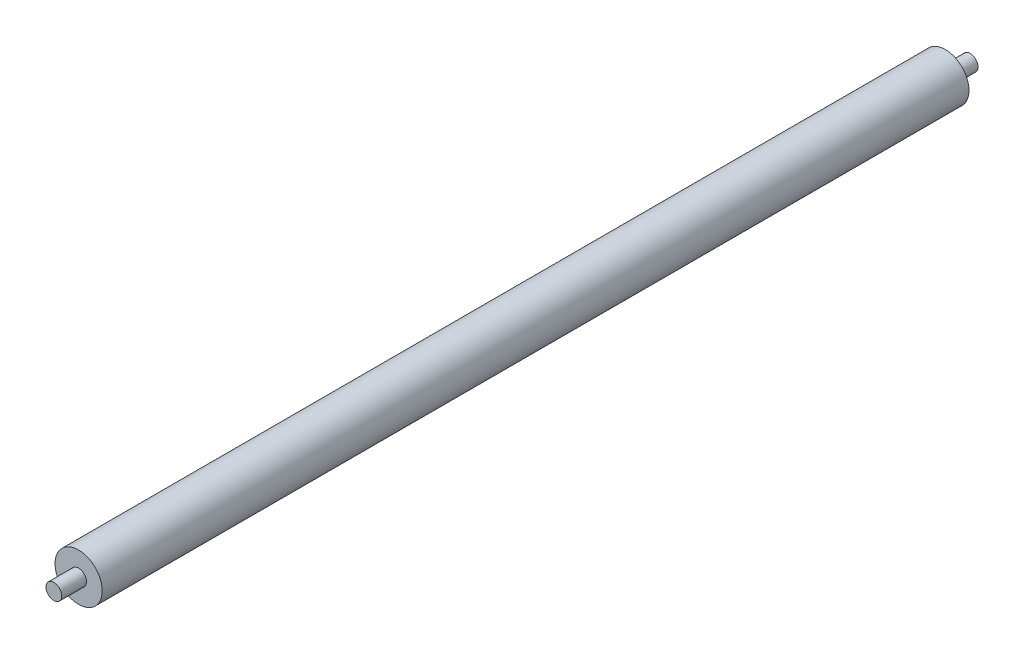
ISO-10303-21;
HEADER;
FILE_DESCRIPTION(('STEP AP214'),'2;1');
FILE_NAME('part.step','',(''),(''),'','','');
FILE_SCHEMA(('AUTOMOTIVE_DESIGN { 1 0 10303 214 1 1 1 1 }'));
ENDSEC;
DATA;
#1=APPLICATION_CONTEXT('core data for automotive mechanical design processes');
#2=APPLICATION_PROTOCOL_DEFINITION('international standard','automotive_design',2000,#1);
#3=PRODUCT_CONTEXT('',#1,'mechanical');
#4=PRODUCT('Part','Part','',(#3));
#5=PRODUCT_RELATED_PRODUCT_CATEGORY('part','',(#4));
#6=PRODUCT_DEFINITION_FORMATION('','',#4);
#7=PRODUCT_DEFINITION_CONTEXT('part definition',#1,'design');
#8=PRODUCT_DEFINITION('design','',#6,#7);
#9=PRODUCT_DEFINITION_SHAPE('','',#8);
#10=(LENGTH_UNIT() NAMED_UNIT(*) SI_UNIT(.MILLI.,.METRE.));
#11=(NAMED_UNIT(*) PLANE_ANGLE_UNIT() SI_UNIT($,.RADIAN.));
#12=(NAMED_UNIT(*) SI_UNIT($,.STERADIAN.) SOLID_ANGLE_UNIT());
#13=UNCERTAINTY_MEASURE_WITH_UNIT(LENGTH_MEASURE(1.E-05),#10,'distance_accuracy_value','');
#14=(GEOMETRIC_REPRESENTATION_CONTEXT(3) GLOBAL_UNCERTAINTY_ASSIGNED_CONTEXT((#13)) GLOBAL_UNIT_ASSIGNED_CONTEXT((#10,
#11,#12)) REPRESENTATION_CONTEXT('',''));
#15=CARTESIAN_POINT('',(0.,0.,0.));
#16=DIRECTION('',(0.,0.,1.));
#17=DIRECTION('',(1.,0.,0.));
#18=AXIS2_PLACEMENT_3D('',#15,#16,#17);
#19=CARTESIAN_POINT('',(0.,0.,350.));
#20=DIRECTION('',(0.,0.,-1.));
#21=DIRECTION('',(-1.,0.,0.));
#22=AXIS2_PLACEMENT_3D('',#19,#20,#21);
#23=CYLINDRICAL_SURFACE('',#22,19.05);
#24=CARTESIAN_POINT('',(0.,0.,350.));
#25=DIRECTION('',(0.,0.,1.));
#26=DIRECTION('',(1.,0.,0.));
#27=AXIS2_PLACEMENT_3D('',#24,#25,#26);
#28=CIRCLE('',#27,19.05);
#29=CARTESIAN_POINT('',(19.05,0.,350.));
#30=VERTEX_POINT('',#29);
#31=EDGE_CURVE('E37',#30,#30,#28,.T.);
#32=ORIENTED_EDGE('',*,*,#31,.F.);
#33=EDGE_LOOP('',(#32));
#34=FACE_BOUND('',#33,.T.);
#35=CARTESIAN_POINT('',(0.,0.,-350.));
#36=DIRECTION('',(0.,0.,1.));
#37=DIRECTION('',(1.,0.,0.));
#38=AXIS2_PLACEMENT_3D('',#35,#36,#37);
#39=CIRCLE('',#38,19.05);
#40=CARTESIAN_POINT('',(19.05,0.,-350.));
#41=VERTEX_POINT('',#40);
#42=EDGE_CURVE('E41',#41,#41,#39,.T.);
#43=ORIENTED_EDGE('',*,*,#42,.T.);
#44=EDGE_LOOP('',(#43));
#45=FACE_BOUND('',#44,.T.);
#46=ADVANCED_FACE('F31',(#34,#45),#23,.T.);
#47=CARTESIAN_POINT('',(0.,0.,350.));
#48=DIRECTION('',(0.,0.,1.));
#49=DIRECTION('',(1.,0.,0.));
#50=AXIS2_PLACEMENT_3D('',#47,#48,#49);
#51=PLANE('',#50);
#52=CARTESIAN_POINT('',(0.,0.,350.));
#53=DIRECTION('',(0.,0.,1.));
#54=DIRECTION('',(1.,0.,0.));
#55=AXIS2_PLACEMENT_3D('',#52,#53,#54);
#56=CIRCLE('',#55,6.35);
#57=CARTESIAN_POINT('',(6.35,0.,350.));
#58=VERTEX_POINT('',#57);
#59=EDGE_CURVE('E46',#58,#58,#56,.F.);
#60=ORIENTED_EDGE('',*,*,#59,.T.);
#61=EDGE_LOOP('',(#60));
#62=FACE_BOUND('',#61,.T.);
#63=ORIENTED_EDGE('',*,*,#31,.T.);
#64=EDGE_LOOP('',(#63));
#65=FACE_BOUND('',#64,.T.);
#66=ADVANCED_FACE('F75',(#62,#65),#51,.T.);
#67=CARTESIAN_POINT('',(0.,0.,-350.));
#68=DIRECTION('',(0.,0.,1.));
#69=DIRECTION('',(1.,0.,0.));
#70=AXIS2_PLACEMENT_3D('',#67,#68,#69);
#71=PLANE('',#70);
#72=CARTESIAN_POINT('',(0.,0.,-350.));
#73=DIRECTION('',(0.,0.,1.));
#74=DIRECTION('',(1.,0.,0.));
#75=AXIS2_PLACEMENT_3D('',#72,#73,#74);
#76=CIRCLE('',#75,6.35);
#77=CARTESIAN_POINT('',(6.35,0.,-350.));
#78=VERTEX_POINT('',#77);
#79=EDGE_CURVE('E10',#78,#78,#76,.F.);
#80=ORIENTED_EDGE('',*,*,#79,.F.);
#81=EDGE_LOOP('',(#80));
#82=FACE_BOUND('',#81,.T.);
#83=ORIENTED_EDGE('',*,*,#42,.F.);
#84=EDGE_LOOP('',(#83));
#85=FACE_BOUND('',#84,.T.);
#86=ADVANCED_FACE('F80',(#82,#85),#71,.F.);
#87=CARTESIAN_POINT('',(0.,0.,-370.));
#88=DIRECTION('',(0.,0.,1.));
#89=DIRECTION('',(1.,0.,0.));
#90=AXIS2_PLACEMENT_3D('',#87,#88,#89);
#91=PLANE('',#90);
#92=CARTESIAN_POINT('',(0.,0.,-370.));
#93=DIRECTION('',(0.,0.,1.));
#94=DIRECTION('',(1.,0.,0.));
#95=AXIS2_PLACEMENT_3D('',#92,#93,#94);
#96=CIRCLE('',#95,6.35);
#97=CARTESIAN_POINT('',(6.35,0.,-370.));
#98=VERTEX_POINT('',#97);
#99=EDGE_CURVE('E51',#98,#98,#96,.T.);
#100=ORIENTED_EDGE('',*,*,#99,.F.);
#101=EDGE_LOOP('',(#100));
#102=FACE_BOUND('',#101,.T.);
#103=ADVANCED_FACE('F69',(#102),#91,.F.);
#104=CARTESIAN_POINT('',(0.,0.,370.));
#105=DIRECTION('',(0.,0.,-1.));
#106=DIRECTION('',(-1.,0.,0.));
#107=AXIS2_PLACEMENT_3D('',#104,#105,#106);
#108=CYLINDRICAL_SURFACE('',#107,6.35);
#109=ORIENTED_EDGE('',*,*,#99,.T.);
#110=EDGE_LOOP('',(#109));
#111=FACE_BOUND('',#110,.T.);
#112=ORIENTED_EDGE('',*,*,#79,.T.);
#113=EDGE_LOOP('',(#112));
#114=FACE_BOUND('',#113,.T.);
#115=ADVANCED_FACE('F61',(#111,#114),#108,.T.);
#116=ORIENTED_EDGE('',*,*,#59,.F.);
#117=EDGE_LOOP('',(#116));
#118=FACE_BOUND('',#117,.T.);
#119=CARTESIAN_POINT('',(0.,0.,370.));
#120=DIRECTION('',(0.,0.,1.));
#121=DIRECTION('',(1.,0.,0.));
#122=AXIS2_PLACEMENT_3D('',#119,#120,#121);
#123=CIRCLE('',#122,6.35);
#124=CARTESIAN_POINT('',(6.35,0.,370.));
#125=VERTEX_POINT('',#124);
#126=EDGE_CURVE('E50',#125,#125,#123,.T.);
#127=ORIENTED_EDGE('',*,*,#126,.F.);
#128=EDGE_LOOP('',(#127));
#129=FACE_BOUND('',#128,.T.);
#130=ADVANCED_FACE('F59',(#118,#129),#108,.T.);
#131=CARTESIAN_POINT('',(0.,0.,370.));
#132=DIRECTION('',(0.,0.,1.));
#133=DIRECTION('',(1.,0.,0.));
#134=AXIS2_PLACEMENT_3D('',#131,#132,#133);
#135=PLANE('',#134);
#136=ORIENTED_EDGE('',*,*,#126,.T.);
#137=EDGE_LOOP('',(#136));
#138=FACE_BOUND('',#137,.T.);
#139=ADVANCED_FACE('F57',(#138),#135,.T.);
#140=CLOSED_SHELL('',(#46,#66,#86,#103,#115,#130,#139));
#141=MANIFOLD_SOLID_BREP('B2',#140);
#142=ADVANCED_BREP_SHAPE_REPRESENTATION('',(#18,#141),#14);
#143=SHAPE_DEFINITION_REPRESENTATION(#9,#142);
ENDSEC;
END-ISO-10303-21;
